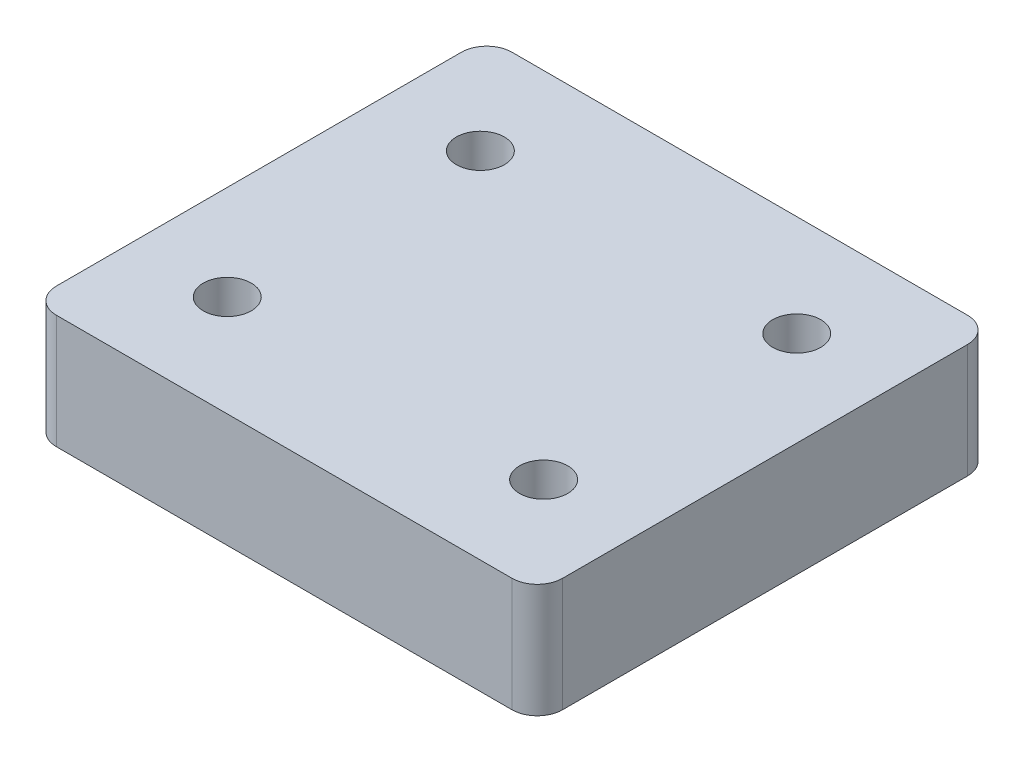
ISO-10303-21;
HEADER;
FILE_DESCRIPTION(('STEP AP214'),'2;1');
FILE_NAME('part.step','',(''),(''),'','','');
FILE_SCHEMA(('AUTOMOTIVE_DESIGN { 1 0 10303 214 1 1 1 1 }'));
ENDSEC;
DATA;
#1=APPLICATION_CONTEXT('core data for automotive mechanical design processes');
#2=APPLICATION_PROTOCOL_DEFINITION('international standard','automotive_design',2000,#1);
#3=PRODUCT_CONTEXT('',#1,'mechanical');
#4=PRODUCT('Part','Part','',(#3));
#5=PRODUCT_RELATED_PRODUCT_CATEGORY('part','',(#4));
#6=PRODUCT_DEFINITION_FORMATION('','',#4);
#7=PRODUCT_DEFINITION_CONTEXT('part definition',#1,'design');
#8=PRODUCT_DEFINITION('design','',#6,#7);
#9=PRODUCT_DEFINITION_SHAPE('','',#8);
#10=(LENGTH_UNIT() NAMED_UNIT(*) SI_UNIT(.MILLI.,.METRE.));
#11=(NAMED_UNIT(*) PLANE_ANGLE_UNIT() SI_UNIT($,.RADIAN.));
#12=(NAMED_UNIT(*) SI_UNIT($,.STERADIAN.) SOLID_ANGLE_UNIT());
#13=UNCERTAINTY_MEASURE_WITH_UNIT(LENGTH_MEASURE(1.E-05),#10,'distance_accuracy_value','');
#14=(GEOMETRIC_REPRESENTATION_CONTEXT(3) GLOBAL_UNCERTAINTY_ASSIGNED_CONTEXT((#13)) GLOBAL_UNIT_ASSIGNED_CONTEXT((#10,
#11,#12)) REPRESENTATION_CONTEXT('',''));
#15=CARTESIAN_POINT('',(0.,0.,0.));
#16=DIRECTION('',(0.,0.,1.));
#17=DIRECTION('',(1.,0.,0.));
#18=AXIS2_PLACEMENT_3D('',#15,#16,#17);
#19=CARTESIAN_POINT('',(-10.5177085809365,9.,-16.6807701449964));
#20=DIRECTION('',(1.,0.,0.));
#21=DIRECTION('',(0.,0.,-1.));
#22=AXIS2_PLACEMENT_3D('',#19,#20,#21);
#23=PLANE('',#22);
#24=DIRECTION('',(0.,0.,1.));
#25=VECTOR('',#24,1.);
#26=CARTESIAN_POINT('',(-10.5177085809365,9.,-16.6807701449964));
#27=LINE('',#26,#25);
#28=CARTESIAN_POINT('',(-10.5177085809365,9.,-14.6807701449964));
#29=VERTEX_POINT('',#28);
#30=CARTESIAN_POINT('',(-10.5177085809365,9.,17.3192298550036));
#31=VERTEX_POINT('',#30);
#32=EDGE_CURVE('E117',#29,#31,#27,.T.);
#33=ORIENTED_EDGE('',*,*,#32,.F.);
#34=DIRECTION('',(0.,-1.,0.));
#35=VECTOR('',#34,1.);
#36=CARTESIAN_POINT('',(-10.5177085809365,9.,-14.6807701449964));
#37=LINE('',#36,#35);
#38=CARTESIAN_POINT('',(-10.5177085809365,0.,-14.6807701449964));
#39=VERTEX_POINT('',#38);
#40=EDGE_CURVE('E102',#29,#39,#37,.T.);
#41=ORIENTED_EDGE('',*,*,#40,.T.);
#42=DIRECTION('',(0.,0.,1.));
#43=VECTOR('',#42,1.);
#44=CARTESIAN_POINT('',(-10.5177085809365,0.,-16.6807701449964));
#45=LINE('',#44,#43);
#46=CARTESIAN_POINT('',(-10.5177085809365,0.,17.3192298550036));
#47=VERTEX_POINT('',#46);
#48=EDGE_CURVE('E114',#39,#47,#45,.T.);
#49=ORIENTED_EDGE('',*,*,#48,.T.);
#50=DIRECTION('',(0.,-1.,0.));
#51=VECTOR('',#50,1.);
#52=CARTESIAN_POINT('',(-10.5177085809365,9.,17.3192298550036));
#53=LINE('',#52,#51);
#54=EDGE_CURVE('E119',#47,#31,#53,.F.);
#55=ORIENTED_EDGE('',*,*,#54,.T.);
#56=EDGE_LOOP('',(#33,#41,#49,#55));
#57=FACE_BOUND('',#56,.T.);
#58=ADVANCED_FACE('F33',(#57),#23,.F.);
#59=CARTESIAN_POINT('',(-10.5177085809365,9.,19.3192298550036));
#60=DIRECTION('',(0.,0.,-1.));
#61=DIRECTION('',(-1.,0.,0.));
#62=AXIS2_PLACEMENT_3D('',#59,#60,#61);
#63=PLANE('',#62);
#64=DIRECTION('',(1.,0.,0.));
#65=VECTOR('',#64,1.);
#66=CARTESIAN_POINT('',(-10.5177085809365,9.,19.3192298550036));
#67=LINE('',#66,#65);
#68=CARTESIAN_POINT('',(-8.5177085809365,9.,19.3192298550036));
#69=VERTEX_POINT('',#68);
#70=CARTESIAN_POINT('',(27.4822914190635,9.,19.3192298550036));
#71=VERTEX_POINT('',#70);
#72=EDGE_CURVE('E181',#69,#71,#67,.T.);
#73=ORIENTED_EDGE('',*,*,#72,.F.);
#74=DIRECTION('',(0.,-1.,0.));
#75=VECTOR('',#74,1.);
#76=CARTESIAN_POINT('',(-8.5177085809365,9.,19.3192298550036));
#77=LINE('',#76,#75);
#78=CARTESIAN_POINT('',(-8.5177085809365,0.,19.3192298550036));
#79=VERTEX_POINT('',#78);
#80=EDGE_CURVE('E165',#69,#79,#77,.T.);
#81=ORIENTED_EDGE('',*,*,#80,.T.);
#82=DIRECTION('',(1.,0.,0.));
#83=VECTOR('',#82,1.);
#84=CARTESIAN_POINT('',(-10.5177085809365,0.,19.3192298550036));
#85=LINE('',#84,#83);
#86=CARTESIAN_POINT('',(27.4822914190635,0.,19.3192298550036));
#87=VERTEX_POINT('',#86);
#88=EDGE_CURVE('E123',#79,#87,#85,.T.);
#89=ORIENTED_EDGE('',*,*,#88,.T.);
#90=DIRECTION('',(0.,-1.,0.));
#91=VECTOR('',#90,1.);
#92=CARTESIAN_POINT('',(27.4822914190635,9.,19.3192298550036));
#93=LINE('',#92,#91);
#94=EDGE_CURVE('E163',#87,#71,#93,.F.);
#95=ORIENTED_EDGE('',*,*,#94,.T.);
#96=EDGE_LOOP('',(#73,#81,#89,#95));
#97=FACE_BOUND('',#96,.T.);
#98=ADVANCED_FACE('F221',(#97),#63,.F.);
#99=CARTESIAN_POINT('',(29.4822914190635,9.,-16.6807701449964));
#100=DIRECTION('',(-1.,0.,0.));
#101=DIRECTION('',(0.,0.,1.));
#102=AXIS2_PLACEMENT_3D('',#99,#100,#101);
#103=PLANE('',#102);
#104=DIRECTION('',(0.,0.,-1.));
#105=VECTOR('',#104,1.);
#106=CARTESIAN_POINT('',(29.4822914190635,0.,-16.6807701449964));
#107=LINE('',#106,#105);
#108=CARTESIAN_POINT('',(29.4822914190635,0.,17.3192298550036));
#109=VERTEX_POINT('',#108);
#110=CARTESIAN_POINT('',(29.4822914190635,0.,-14.6807701449964));
#111=VERTEX_POINT('',#110);
#112=EDGE_CURVE('E127',#109,#111,#107,.T.);
#113=ORIENTED_EDGE('',*,*,#112,.T.);
#114=DIRECTION('',(0.,-1.,0.));
#115=VECTOR('',#114,1.);
#116=CARTESIAN_POINT('',(29.4822914190635,9.,-14.6807701449964));
#117=LINE('',#116,#115);
#118=CARTESIAN_POINT('',(29.4822914190635,9.,-14.6807701449964));
#119=VERTEX_POINT('',#118);
#120=EDGE_CURVE('E11',#111,#119,#117,.F.);
#121=ORIENTED_EDGE('',*,*,#120,.T.);
#122=DIRECTION('',(0.,0.,-1.));
#123=VECTOR('',#122,1.);
#124=CARTESIAN_POINT('',(29.4822914190635,9.,-16.6807701449964));
#125=LINE('',#124,#123);
#126=CARTESIAN_POINT('',(29.4822914190635,9.,17.3192298550036));
#127=VERTEX_POINT('',#126);
#128=EDGE_CURVE('E171',#127,#119,#125,.T.);
#129=ORIENTED_EDGE('',*,*,#128,.F.);
#130=DIRECTION('',(0.,-1.,0.));
#131=VECTOR('',#130,1.);
#132=CARTESIAN_POINT('',(29.4822914190635,9.,17.3192298550036));
#133=LINE('',#132,#131);
#134=EDGE_CURVE('E41',#127,#109,#133,.T.);
#135=ORIENTED_EDGE('',*,*,#134,.T.);
#136=EDGE_LOOP('',(#113,#121,#129,#135));
#137=FACE_BOUND('',#136,.T.);
#138=ADVANCED_FACE('F170',(#137),#103,.F.);
#139=CARTESIAN_POINT('',(-10.5177085809365,9.,-16.6807701449964));
#140=DIRECTION('',(0.,0.,1.));
#141=DIRECTION('',(1.,0.,0.));
#142=AXIS2_PLACEMENT_3D('',#139,#140,#141);
#143=PLANE('',#142);
#144=DIRECTION('',(-1.,0.,0.));
#145=VECTOR('',#144,1.);
#146=CARTESIAN_POINT('',(-10.5177085809365,0.,-16.6807701449964));
#147=LINE('',#146,#145);
#148=CARTESIAN_POINT('',(27.4822914190635,0.,-16.6807701449964));
#149=VERTEX_POINT('',#148);
#150=CARTESIAN_POINT('',(-8.5177085809365,0.,-16.6807701449964));
#151=VERTEX_POINT('',#150);
#152=EDGE_CURVE('E137',#149,#151,#147,.T.);
#153=ORIENTED_EDGE('',*,*,#152,.T.);
#154=DIRECTION('',(0.,-1.,0.));
#155=VECTOR('',#154,1.);
#156=CARTESIAN_POINT('',(-8.5177085809365,9.,-16.6807701449964));
#157=LINE('',#156,#155);
#158=CARTESIAN_POINT('',(-8.5177085809365,9.,-16.6807701449964));
#159=VERTEX_POINT('',#158);
#160=EDGE_CURVE('E103',#151,#159,#157,.F.);
#161=ORIENTED_EDGE('',*,*,#160,.T.);
#162=DIRECTION('',(-1.,0.,0.));
#163=VECTOR('',#162,1.);
#164=CARTESIAN_POINT('',(-10.5177085809365,9.,-16.6807701449964));
#165=LINE('',#164,#163);
#166=CARTESIAN_POINT('',(27.4822914190635,9.,-16.6807701449964));
#167=VERTEX_POINT('',#166);
#168=EDGE_CURVE('E133',#167,#159,#165,.T.);
#169=ORIENTED_EDGE('',*,*,#168,.F.);
#170=DIRECTION('',(0.,-1.,0.));
#171=VECTOR('',#170,1.);
#172=CARTESIAN_POINT('',(27.4822914190635,9.,-16.6807701449964));
#173=LINE('',#172,#171);
#174=EDGE_CURVE('E108',#167,#149,#173,.T.);
#175=ORIENTED_EDGE('',*,*,#174,.T.);
#176=EDGE_LOOP('',(#153,#161,#169,#175));
#177=FACE_BOUND('',#176,.T.);
#178=ADVANCED_FACE('F179',(#177),#143,.F.);
#179=CARTESIAN_POINT('',(0.,9.,0.));
#180=DIRECTION('',(0.,1.,0.));
#181=DIRECTION('',(0.,0.,1.));
#182=AXIS2_PLACEMENT_3D('',#179,#180,#181);
#183=PLANE('',#182);
#184=CARTESIAN_POINT('',(-3.0177085809365,9.,-8.68077014499643));
#185=DIRECTION('',(0.,1.,0.));
#186=DIRECTION('',(0.,0.,1.));
#187=AXIS2_PLACEMENT_3D('',#184,#185,#186);
#188=CIRCLE('',#187,1.9);
#189=CARTESIAN_POINT('',(-3.0177085809365,9.,-6.78077014499643));
#190=VERTEX_POINT('',#189);
#191=EDGE_CURVE('E188',#190,#190,#188,.T.);
#192=ORIENTED_EDGE('',*,*,#191,.F.);
#193=EDGE_LOOP('',(#192));
#194=FACE_BOUND('',#193,.T.);
#195=CARTESIAN_POINT('',(21.9822914190635,9.,-8.68077014499643));
#196=DIRECTION('',(0.,1.,0.));
#197=DIRECTION('',(0.,0.,1.));
#198=AXIS2_PLACEMENT_3D('',#195,#196,#197);
#199=CIRCLE('',#198,1.9);
#200=CARTESIAN_POINT('',(21.9822914190635,9.,-6.78077014499643));
#201=VERTEX_POINT('',#200);
#202=EDGE_CURVE('E191',#201,#201,#199,.T.);
#203=ORIENTED_EDGE('',*,*,#202,.F.);
#204=EDGE_LOOP('',(#203));
#205=FACE_BOUND('',#204,.T.);
#206=CARTESIAN_POINT('',(21.9822914190635,9.,11.3192298550036));
#207=DIRECTION('',(0.,1.,0.));
#208=DIRECTION('',(0.,0.,1.));
#209=AXIS2_PLACEMENT_3D('',#206,#207,#208);
#210=CIRCLE('',#209,1.9);
#211=CARTESIAN_POINT('',(21.9822914190635,9.,13.2192298550036));
#212=VERTEX_POINT('',#211);
#213=EDGE_CURVE('E187',#212,#212,#210,.T.);
#214=ORIENTED_EDGE('',*,*,#213,.F.);
#215=EDGE_LOOP('',(#214));
#216=FACE_BOUND('',#215,.T.);
#217=CARTESIAN_POINT('',(-3.0177085809365,9.,11.3192298550036));
#218=DIRECTION('',(0.,1.,0.));
#219=DIRECTION('',(0.,0.,1.));
#220=AXIS2_PLACEMENT_3D('',#217,#218,#219);
#221=CIRCLE('',#220,1.9);
#222=CARTESIAN_POINT('',(-3.0177085809365,9.,13.2192298550036));
#223=VERTEX_POINT('',#222);
#224=EDGE_CURVE('E143',#223,#223,#221,.T.);
#225=ORIENTED_EDGE('',*,*,#224,.F.);
#226=EDGE_LOOP('',(#225));
#227=FACE_BOUND('',#226,.T.);
#228=ORIENTED_EDGE('',*,*,#168,.T.);
#229=CARTESIAN_POINT('',(-8.5177085809365,9.,-14.6807701449964));
#230=DIRECTION('',(0.,1.,0.));
#231=DIRECTION('',(0.,0.,1.));
#232=AXIS2_PLACEMENT_3D('',#229,#230,#231);
#233=CIRCLE('',#232,2.);
#234=EDGE_CURVE('E161',#159,#29,#233,.T.);
#235=ORIENTED_EDGE('',*,*,#234,.T.);
#236=ORIENTED_EDGE('',*,*,#32,.T.);
#237=CARTESIAN_POINT('',(-8.5177085809365,9.,17.3192298550036));
#238=DIRECTION('',(0.,1.,0.));
#239=DIRECTION('',(0.,0.,1.));
#240=AXIS2_PLACEMENT_3D('',#237,#238,#239);
#241=CIRCLE('',#240,2.);
#242=EDGE_CURVE('E159',#31,#69,#241,.T.);
#243=ORIENTED_EDGE('',*,*,#242,.T.);
#244=ORIENTED_EDGE('',*,*,#72,.T.);
#245=CARTESIAN_POINT('',(27.4822914190635,9.,17.3192298550036));
#246=DIRECTION('',(0.,1.,0.));
#247=DIRECTION('',(0.,0.,1.));
#248=AXIS2_PLACEMENT_3D('',#245,#246,#247);
#249=CIRCLE('',#248,2.);
#250=EDGE_CURVE('E53',#71,#127,#249,.T.);
#251=ORIENTED_EDGE('',*,*,#250,.T.);
#252=ORIENTED_EDGE('',*,*,#128,.T.);
#253=CARTESIAN_POINT('',(27.4822914190635,9.,-14.6807701449964));
#254=DIRECTION('',(0.,1.,0.));
#255=DIRECTION('',(0.,0.,1.));
#256=AXIS2_PLACEMENT_3D('',#253,#254,#255);
#257=CIRCLE('',#256,2.);
#258=EDGE_CURVE('E157',#119,#167,#257,.T.);
#259=ORIENTED_EDGE('',*,*,#258,.T.);
#260=EDGE_LOOP('',(#228,#235,#236,#243,#244,#251,#252,#259));
#261=FACE_BOUND('',#260,.T.);
#262=ADVANCED_FACE('F200',(#194,#205,#216,#227,#261),#183,.T.);
#263=CARTESIAN_POINT('',(0.,0.,0.));
#264=DIRECTION('',(0.,1.,0.));
#265=DIRECTION('',(0.,0.,1.));
#266=AXIS2_PLACEMENT_3D('',#263,#264,#265);
#267=PLANE('',#266);
#268=CARTESIAN_POINT('',(-3.0177085809365,0.,-8.68077014499643));
#269=DIRECTION('',(0.,1.,0.));
#270=DIRECTION('',(0.,0.,1.));
#271=AXIS2_PLACEMENT_3D('',#268,#269,#270);
#272=CIRCLE('',#271,1.9);
#273=CARTESIAN_POINT('',(-3.0177085809365,0.,-6.78077014499643));
#274=VERTEX_POINT('',#273);
#275=EDGE_CURVE('E124',#274,#274,#272,.T.);
#276=ORIENTED_EDGE('',*,*,#275,.T.);
#277=EDGE_LOOP('',(#276));
#278=FACE_BOUND('',#277,.T.);
#279=CARTESIAN_POINT('',(21.9822914190635,0.,-8.68077014499643));
#280=DIRECTION('',(0.,1.,0.));
#281=DIRECTION('',(0.,0.,1.));
#282=AXIS2_PLACEMENT_3D('',#279,#280,#281);
#283=CIRCLE('',#282,1.9);
#284=CARTESIAN_POINT('',(21.9822914190635,0.,-6.78077014499643));
#285=VERTEX_POINT('',#284);
#286=EDGE_CURVE('E130',#285,#285,#283,.T.);
#287=ORIENTED_EDGE('',*,*,#286,.T.);
#288=EDGE_LOOP('',(#287));
#289=FACE_BOUND('',#288,.T.);
#290=CARTESIAN_POINT('',(21.9822914190635,0.,11.3192298550036));
#291=DIRECTION('',(0.,1.,0.));
#292=DIRECTION('',(0.,0.,1.));
#293=AXIS2_PLACEMENT_3D('',#290,#291,#292);
#294=CIRCLE('',#293,1.9);
#295=CARTESIAN_POINT('',(21.9822914190635,0.,13.2192298550036));
#296=VERTEX_POINT('',#295);
#297=EDGE_CURVE('E142',#296,#296,#294,.T.);
#298=ORIENTED_EDGE('',*,*,#297,.T.);
#299=EDGE_LOOP('',(#298));
#300=FACE_BOUND('',#299,.T.);
#301=CARTESIAN_POINT('',(-3.0177085809365,0.,11.3192298550036));
#302=DIRECTION('',(0.,1.,0.));
#303=DIRECTION('',(0.,0.,1.));
#304=AXIS2_PLACEMENT_3D('',#301,#302,#303);
#305=CIRCLE('',#304,1.9);
#306=CARTESIAN_POINT('',(-3.0177085809365,0.,13.2192298550036));
#307=VERTEX_POINT('',#306);
#308=EDGE_CURVE('E139',#307,#307,#305,.T.);
#309=ORIENTED_EDGE('',*,*,#308,.T.);
#310=EDGE_LOOP('',(#309));
#311=FACE_BOUND('',#310,.T.);
#312=ORIENTED_EDGE('',*,*,#48,.F.);
#313=CARTESIAN_POINT('',(-8.5177085809365,0.,-14.6807701449964));
#314=DIRECTION('',(0.,1.,0.));
#315=DIRECTION('',(0.,0.,1.));
#316=AXIS2_PLACEMENT_3D('',#313,#314,#315);
#317=CIRCLE('',#316,2.);
#318=EDGE_CURVE('E98',#39,#151,#317,.F.);
#319=ORIENTED_EDGE('',*,*,#318,.T.);
#320=ORIENTED_EDGE('',*,*,#152,.F.);
#321=CARTESIAN_POINT('',(27.4822914190635,0.,-14.6807701449964));
#322=DIRECTION('',(0.,1.,0.));
#323=DIRECTION('',(0.,0.,1.));
#324=AXIS2_PLACEMENT_3D('',#321,#322,#323);
#325=CIRCLE('',#324,2.);
#326=EDGE_CURVE('E150',#149,#111,#325,.F.);
#327=ORIENTED_EDGE('',*,*,#326,.T.);
#328=ORIENTED_EDGE('',*,*,#112,.F.);
#329=CARTESIAN_POINT('',(27.4822914190635,0.,17.3192298550036));
#330=DIRECTION('',(0.,1.,0.));
#331=DIRECTION('',(0.,0.,1.));
#332=AXIS2_PLACEMENT_3D('',#329,#330,#331);
#333=CIRCLE('',#332,2.);
#334=EDGE_CURVE('E118',#109,#87,#333,.F.);
#335=ORIENTED_EDGE('',*,*,#334,.T.);
#336=ORIENTED_EDGE('',*,*,#88,.F.);
#337=CARTESIAN_POINT('',(-8.5177085809365,0.,17.3192298550036));
#338=DIRECTION('',(0.,1.,0.));
#339=DIRECTION('',(0.,0.,1.));
#340=AXIS2_PLACEMENT_3D('',#337,#338,#339);
#341=CIRCLE('',#340,2.);
#342=EDGE_CURVE('E109',#79,#47,#341,.F.);
#343=ORIENTED_EDGE('',*,*,#342,.T.);
#344=EDGE_LOOP('',(#312,#319,#320,#327,#328,#335,#336,#343));
#345=FACE_BOUND('',#344,.T.);
#346=ADVANCED_FACE('F121',(#278,#289,#300,#311,#345),#267,.F.);
#347=CARTESIAN_POINT('',(-3.0177085809365,-1.,11.3192298550036));
#348=DIRECTION('',(0.,1.,0.));
#349=DIRECTION('',(0.,0.,1.));
#350=AXIS2_PLACEMENT_3D('',#347,#348,#349);
#351=CYLINDRICAL_SURFACE('',#350,1.9);
#352=ORIENTED_EDGE('',*,*,#224,.T.);
#353=EDGE_LOOP('',(#352));
#354=FACE_BOUND('',#353,.T.);
#355=ORIENTED_EDGE('',*,*,#308,.F.);
#356=EDGE_LOOP('',(#355));
#357=FACE_BOUND('',#356,.T.);
#358=ADVANCED_FACE('F207',(#354,#357),#351,.F.);
#359=CARTESIAN_POINT('',(21.9822914190635,-1.,11.3192298550036));
#360=DIRECTION('',(0.,1.,0.));
#361=DIRECTION('',(0.,0.,1.));
#362=AXIS2_PLACEMENT_3D('',#359,#360,#361);
#363=CYLINDRICAL_SURFACE('',#362,1.9);
#364=ORIENTED_EDGE('',*,*,#213,.T.);
#365=EDGE_LOOP('',(#364));
#366=FACE_BOUND('',#365,.T.);
#367=ORIENTED_EDGE('',*,*,#297,.F.);
#368=EDGE_LOOP('',(#367));
#369=FACE_BOUND('',#368,.T.);
#370=ADVANCED_FACE('F197',(#366,#369),#363,.F.);
#371=CARTESIAN_POINT('',(21.9822914190635,-1.,-8.68077014499643));
#372=DIRECTION('',(0.,1.,0.));
#373=DIRECTION('',(0.,0.,1.));
#374=AXIS2_PLACEMENT_3D('',#371,#372,#373);
#375=CYLINDRICAL_SURFACE('',#374,1.9);
#376=ORIENTED_EDGE('',*,*,#202,.T.);
#377=EDGE_LOOP('',(#376));
#378=FACE_BOUND('',#377,.T.);
#379=ORIENTED_EDGE('',*,*,#286,.F.);
#380=EDGE_LOOP('',(#379));
#381=FACE_BOUND('',#380,.T.);
#382=ADVANCED_FACE('F306',(#378,#381),#375,.F.);
#383=CARTESIAN_POINT('',(-3.0177085809365,-1.,-8.68077014499643));
#384=DIRECTION('',(0.,1.,0.));
#385=DIRECTION('',(0.,0.,1.));
#386=AXIS2_PLACEMENT_3D('',#383,#384,#385);
#387=CYLINDRICAL_SURFACE('',#386,1.9);
#388=ORIENTED_EDGE('',*,*,#191,.T.);
#389=EDGE_LOOP('',(#388));
#390=FACE_BOUND('',#389,.T.);
#391=ORIENTED_EDGE('',*,*,#275,.F.);
#392=EDGE_LOOP('',(#391));
#393=FACE_BOUND('',#392,.T.);
#394=ADVANCED_FACE('F233',(#390,#393),#387,.F.);
#395=CARTESIAN_POINT('',(-8.5177085809365,9.,-14.6807701449964));
#396=DIRECTION('',(0.,-1.,0.));
#397=DIRECTION('',(0.,0.,-1.));
#398=AXIS2_PLACEMENT_3D('',#395,#396,#397);
#399=CYLINDRICAL_SURFACE('',#398,2.);
#400=ORIENTED_EDGE('',*,*,#234,.F.);
#401=ORIENTED_EDGE('',*,*,#160,.F.);
#402=ORIENTED_EDGE('',*,*,#318,.F.);
#403=ORIENTED_EDGE('',*,*,#40,.F.);
#404=EDGE_LOOP('',(#400,#401,#402,#403));
#405=FACE_BOUND('',#404,.T.);
#406=ADVANCED_FACE('F101',(#405),#399,.T.);
#407=CARTESIAN_POINT('',(-8.5177085809365,9.,17.3192298550036));
#408=DIRECTION('',(0.,-1.,0.));
#409=DIRECTION('',(0.,0.,-1.));
#410=AXIS2_PLACEMENT_3D('',#407,#408,#409);
#411=CYLINDRICAL_SURFACE('',#410,2.);
#412=ORIENTED_EDGE('',*,*,#242,.F.);
#413=ORIENTED_EDGE('',*,*,#54,.F.);
#414=ORIENTED_EDGE('',*,*,#342,.F.);
#415=ORIENTED_EDGE('',*,*,#80,.F.);
#416=EDGE_LOOP('',(#412,#413,#414,#415));
#417=FACE_BOUND('',#416,.T.);
#418=ADVANCED_FACE('F232',(#417),#411,.T.);
#419=CARTESIAN_POINT('',(27.4822914190635,9.,-14.6807701449964));
#420=DIRECTION('',(0.,-1.,0.));
#421=DIRECTION('',(0.,0.,-1.));
#422=AXIS2_PLACEMENT_3D('',#419,#420,#421);
#423=CYLINDRICAL_SURFACE('',#422,2.);
#424=ORIENTED_EDGE('',*,*,#258,.F.);
#425=ORIENTED_EDGE('',*,*,#120,.F.);
#426=ORIENTED_EDGE('',*,*,#326,.F.);
#427=ORIENTED_EDGE('',*,*,#174,.F.);
#428=EDGE_LOOP('',(#424,#425,#426,#427));
#429=FACE_BOUND('',#428,.T.);
#430=ADVANCED_FACE('F176',(#429),#423,.T.);
#431=CARTESIAN_POINT('',(27.4822914190635,9.,17.3192298550036));
#432=DIRECTION('',(0.,-1.,0.));
#433=DIRECTION('',(0.,0.,-1.));
#434=AXIS2_PLACEMENT_3D('',#431,#432,#433);
#435=CYLINDRICAL_SURFACE('',#434,2.);
#436=ORIENTED_EDGE('',*,*,#250,.F.);
#437=ORIENTED_EDGE('',*,*,#94,.F.);
#438=ORIENTED_EDGE('',*,*,#334,.F.);
#439=ORIENTED_EDGE('',*,*,#134,.F.);
#440=EDGE_LOOP('',(#436,#437,#438,#439));
#441=FACE_BOUND('',#440,.T.);
#442=ADVANCED_FACE('F35',(#441),#435,.T.);
#443=CLOSED_SHELL('',(#58,#98,#138,#178,#262,#346,#358,#370,#382,#394,#406,#418,#430,#442));
#444=MANIFOLD_SOLID_BREP('B2',#443);
#445=ADVANCED_BREP_SHAPE_REPRESENTATION('',(#18,#444),#14);
#446=SHAPE_DEFINITION_REPRESENTATION(#9,#445);
ENDSEC;
END-ISO-10303-21;
